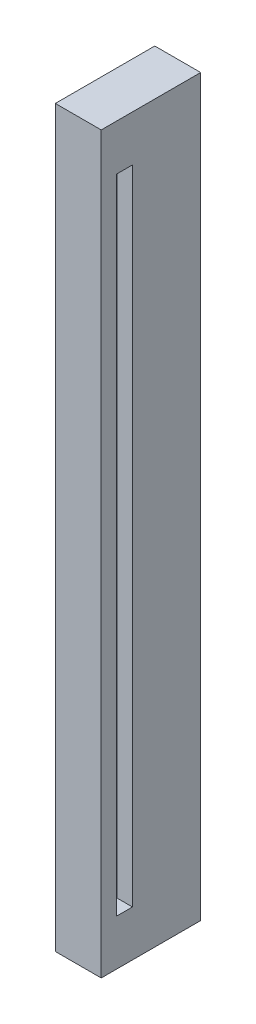
ISO-10303-21;
HEADER;
FILE_DESCRIPTION(('STEP AP214'),'2;1');
FILE_NAME('part.step','',(''),(''),'','','');
FILE_SCHEMA(('AUTOMOTIVE_DESIGN { 1 0 10303 214 1 1 1 1 }'));
ENDSEC;
DATA;
#1=APPLICATION_CONTEXT('core data for automotive mechanical design processes');
#2=APPLICATION_PROTOCOL_DEFINITION('international standard','automotive_design',2000,#1);
#3=PRODUCT_CONTEXT('',#1,'mechanical');
#4=PRODUCT('Part','Part','',(#3));
#5=PRODUCT_RELATED_PRODUCT_CATEGORY('part','',(#4));
#6=PRODUCT_DEFINITION_FORMATION('','',#4);
#7=PRODUCT_DEFINITION_CONTEXT('part definition',#1,'design');
#8=PRODUCT_DEFINITION('design','',#6,#7);
#9=PRODUCT_DEFINITION_SHAPE('','',#8);
#10=(LENGTH_UNIT() NAMED_UNIT(*) SI_UNIT(.MILLI.,.METRE.));
#11=(NAMED_UNIT(*) PLANE_ANGLE_UNIT() SI_UNIT($,.RADIAN.));
#12=(NAMED_UNIT(*) SI_UNIT($,.STERADIAN.) SOLID_ANGLE_UNIT());
#13=UNCERTAINTY_MEASURE_WITH_UNIT(LENGTH_MEASURE(1.E-05),#10,'distance_accuracy_value','');
#14=(GEOMETRIC_REPRESENTATION_CONTEXT(3) GLOBAL_UNCERTAINTY_ASSIGNED_CONTEXT((#13)) GLOBAL_UNIT_ASSIGNED_CONTEXT((#10,
#11,#12)) REPRESENTATION_CONTEXT('',''));
#15=CARTESIAN_POINT('',(0.,0.,0.));
#16=DIRECTION('',(0.,0.,1.));
#17=DIRECTION('',(1.,0.,0.));
#18=AXIS2_PLACEMENT_3D('',#15,#16,#17);
#19=CARTESIAN_POINT('',(9.525,-152.4,41.275));
#20=DIRECTION('',(-1.,0.,0.));
#21=DIRECTION('',(0.,0.,1.));
#22=AXIS2_PLACEMENT_3D('',#19,#20,#21);
#23=PLANE('',#22);
#24=DIRECTION('',(0.,0.,-1.));
#25=VECTOR('',#24,1.);
#26=CARTESIAN_POINT('',(9.525,-133.35,34.925));
#27=LINE('',#26,#25);
#28=CARTESIAN_POINT('',(9.525,-133.35,34.925));
#29=VERTEX_POINT('',#28);
#30=CARTESIAN_POINT('',(9.525,-133.35,28.321));
#31=VERTEX_POINT('',#30);
#32=EDGE_CURVE('E135',#29,#31,#27,.T.);
#33=ORIENTED_EDGE('',*,*,#32,.F.);
#34=DIRECTION('',(0.,-1.,0.));
#35=VECTOR('',#34,1.);
#36=CARTESIAN_POINT('',(9.525,133.35,34.925));
#37=LINE('',#36,#35);
#38=CARTESIAN_POINT('',(9.525,133.35,34.925));
#39=VERTEX_POINT('',#38);
#40=EDGE_CURVE('E47',#39,#29,#37,.T.);
#41=ORIENTED_EDGE('',*,*,#40,.F.);
#42=DIRECTION('',(0.,0.,1.));
#43=VECTOR('',#42,1.);
#44=CARTESIAN_POINT('',(9.525,133.35,34.925));
#45=LINE('',#44,#43);
#46=CARTESIAN_POINT('',(9.525,133.35,28.321));
#47=VERTEX_POINT('',#46);
#48=EDGE_CURVE('E126',#47,#39,#45,.T.);
#49=ORIENTED_EDGE('',*,*,#48,.F.);
#50=DIRECTION('',(0.,1.,0.));
#51=VECTOR('',#50,1.);
#52=CARTESIAN_POINT('',(9.525,133.35,28.321));
#53=LINE('',#52,#51);
#54=EDGE_CURVE('E129',#31,#47,#53,.T.);
#55=ORIENTED_EDGE('',*,*,#54,.F.);
#56=EDGE_LOOP('',(#33,#41,#49,#55));
#57=FACE_BOUND('',#56,.T.);
#58=DIRECTION('',(0.,1.,0.));
#59=VECTOR('',#58,1.);
#60=CARTESIAN_POINT('',(9.525,-152.4,0.));
#61=LINE('',#60,#59);
#62=CARTESIAN_POINT('',(9.525,-152.4,0.));
#63=VERTEX_POINT('',#62);
#64=CARTESIAN_POINT('',(9.525,152.4,0.));
#65=VERTEX_POINT('',#64);
#66=EDGE_CURVE('E141',#63,#65,#61,.T.);
#67=ORIENTED_EDGE('',*,*,#66,.T.);
#68=DIRECTION('',(0.,0.,-1.));
#69=VECTOR('',#68,1.);
#70=CARTESIAN_POINT('',(9.525,152.4,41.275));
#71=LINE('',#70,#69);
#72=CARTESIAN_POINT('',(9.525,152.4,41.275));
#73=VERTEX_POINT('',#72);
#74=EDGE_CURVE('E11',#73,#65,#71,.T.);
#75=ORIENTED_EDGE('',*,*,#74,.F.);
#76=DIRECTION('',(0.,1.,0.));
#77=VECTOR('',#76,1.);
#78=CARTESIAN_POINT('',(9.525,-152.4,41.275));
#79=LINE('',#78,#77);
#80=CARTESIAN_POINT('',(9.525,-152.4,41.275));
#81=VERTEX_POINT('',#80);
#82=EDGE_CURVE('E145',#81,#73,#79,.T.);
#83=ORIENTED_EDGE('',*,*,#82,.F.);
#84=DIRECTION('',(0.,0.,-1.));
#85=VECTOR('',#84,1.);
#86=CARTESIAN_POINT('',(9.525,-152.4,41.275));
#87=LINE('',#86,#85);
#88=EDGE_CURVE('E151',#81,#63,#87,.T.);
#89=ORIENTED_EDGE('',*,*,#88,.T.);
#90=EDGE_LOOP('',(#67,#75,#83,#89));
#91=FACE_BOUND('',#90,.T.);
#92=ADVANCED_FACE('F33',(#57,#91),#23,.F.);
#93=CARTESIAN_POINT('',(-9.525,152.4,41.275));
#94=DIRECTION('',(0.,-1.,0.));
#95=DIRECTION('',(0.,0.,-1.));
#96=AXIS2_PLACEMENT_3D('',#93,#94,#95);
#97=PLANE('',#96);
#98=DIRECTION('',(-1.,0.,0.));
#99=VECTOR('',#98,1.);
#100=CARTESIAN_POINT('',(-9.525,152.4,0.));
#101=LINE('',#100,#99);
#102=CARTESIAN_POINT('',(-9.525,152.4,0.));
#103=VERTEX_POINT('',#102);
#104=EDGE_CURVE('E154',#65,#103,#101,.T.);
#105=ORIENTED_EDGE('',*,*,#104,.T.);
#106=DIRECTION('',(0.,0.,-1.));
#107=VECTOR('',#106,1.);
#108=CARTESIAN_POINT('',(-9.525,152.4,41.275));
#109=LINE('',#108,#107);
#110=CARTESIAN_POINT('',(-9.525,152.4,41.275));
#111=VERTEX_POINT('',#110);
#112=EDGE_CURVE('E40',#111,#103,#109,.T.);
#113=ORIENTED_EDGE('',*,*,#112,.F.);
#114=DIRECTION('',(-1.,0.,0.));
#115=VECTOR('',#114,1.);
#116=CARTESIAN_POINT('',(-9.525,152.4,41.275));
#117=LINE('',#116,#115);
#118=EDGE_CURVE('E84',#73,#111,#117,.T.);
#119=ORIENTED_EDGE('',*,*,#118,.F.);
#120=ORIENTED_EDGE('',*,*,#74,.T.);
#121=EDGE_LOOP('',(#105,#113,#119,#120));
#122=FACE_BOUND('',#121,.T.);
#123=ADVANCED_FACE('F182',(#122),#97,.F.);
#124=CARTESIAN_POINT('',(-9.525,-152.4,41.275));
#125=DIRECTION('',(1.,0.,0.));
#126=DIRECTION('',(0.,0.,-1.));
#127=AXIS2_PLACEMENT_3D('',#124,#125,#126);
#128=PLANE('',#127);
#129=DIRECTION('',(0.,-1.,0.));
#130=VECTOR('',#129,1.);
#131=CARTESIAN_POINT('',(-9.525,-152.4,0.));
#132=LINE('',#131,#130);
#133=CARTESIAN_POINT('',(-9.525,-152.4,0.));
#134=VERTEX_POINT('',#133);
#135=EDGE_CURVE('E156',#103,#134,#132,.T.);
#136=ORIENTED_EDGE('',*,*,#135,.T.);
#137=DIRECTION('',(0.,0.,-1.));
#138=VECTOR('',#137,1.);
#139=CARTESIAN_POINT('',(-9.525,-152.4,41.275));
#140=LINE('',#139,#138);
#141=CARTESIAN_POINT('',(-9.525,-152.4,41.275));
#142=VERTEX_POINT('',#141);
#143=EDGE_CURVE('E160',#142,#134,#140,.T.);
#144=ORIENTED_EDGE('',*,*,#143,.F.);
#145=DIRECTION('',(0.,-1.,0.));
#146=VECTOR('',#145,1.);
#147=CARTESIAN_POINT('',(-9.525,-152.4,41.275));
#148=LINE('',#147,#146);
#149=EDGE_CURVE('E148',#111,#142,#148,.T.);
#150=ORIENTED_EDGE('',*,*,#149,.F.);
#151=ORIENTED_EDGE('',*,*,#112,.T.);
#152=EDGE_LOOP('',(#136,#144,#150,#151));
#153=FACE_BOUND('',#152,.T.);
#154=ADVANCED_FACE('F165',(#153),#128,.F.);
#155=CARTESIAN_POINT('',(-9.525,-152.4,41.275));
#156=DIRECTION('',(0.,1.,0.));
#157=DIRECTION('',(0.,0.,1.));
#158=AXIS2_PLACEMENT_3D('',#155,#156,#157);
#159=PLANE('',#158);
#160=DIRECTION('',(1.,0.,0.));
#161=VECTOR('',#160,1.);
#162=CARTESIAN_POINT('',(-9.525,-152.4,0.));
#163=LINE('',#162,#161);
#164=EDGE_CURVE('E77',#134,#63,#163,.T.);
#165=ORIENTED_EDGE('',*,*,#164,.T.);
#166=ORIENTED_EDGE('',*,*,#88,.F.);
#167=DIRECTION('',(1.,0.,0.));
#168=VECTOR('',#167,1.);
#169=CARTESIAN_POINT('',(-9.525,-152.4,41.275));
#170=LINE('',#169,#168);
#171=EDGE_CURVE('E56',#142,#81,#170,.T.);
#172=ORIENTED_EDGE('',*,*,#171,.F.);
#173=ORIENTED_EDGE('',*,*,#143,.T.);
#174=EDGE_LOOP('',(#165,#166,#172,#173));
#175=FACE_BOUND('',#174,.T.);
#176=ADVANCED_FACE('F173',(#175),#159,.F.);
#177=CARTESIAN_POINT('',(0.,0.,41.275));
#178=DIRECTION('',(0.,0.,-1.));
#179=DIRECTION('',(-1.,0.,0.));
#180=AXIS2_PLACEMENT_3D('',#177,#178,#179);
#181=PLANE('',#180);
#182=ORIENTED_EDGE('',*,*,#82,.T.);
#183=ORIENTED_EDGE('',*,*,#118,.T.);
#184=ORIENTED_EDGE('',*,*,#149,.T.);
#185=ORIENTED_EDGE('',*,*,#171,.T.);
#186=EDGE_LOOP('',(#182,#183,#184,#185));
#187=FACE_BOUND('',#186,.T.);
#188=ADVANCED_FACE('F175',(#187),#181,.F.);
#189=CARTESIAN_POINT('',(0.,0.,0.));
#190=DIRECTION('',(0.,0.,-1.));
#191=DIRECTION('',(-1.,0.,0.));
#192=AXIS2_PLACEMENT_3D('',#189,#190,#191);
#193=PLANE('',#192);
#194=ORIENTED_EDGE('',*,*,#66,.F.);
#195=ORIENTED_EDGE('',*,*,#164,.F.);
#196=ORIENTED_EDGE('',*,*,#135,.F.);
#197=ORIENTED_EDGE('',*,*,#104,.F.);
#198=EDGE_LOOP('',(#194,#195,#196,#197));
#199=FACE_BOUND('',#198,.T.);
#200=ADVANCED_FACE('F169',(#199),#193,.T.);
#201=CARTESIAN_POINT('',(3.175,133.35,34.925));
#202=DIRECTION('',(0.,0.,1.));
#203=DIRECTION('',(1.,0.,0.));
#204=AXIS2_PLACEMENT_3D('',#201,#202,#203);
#205=PLANE('',#204);
#206=ORIENTED_EDGE('',*,*,#40,.T.);
#207=DIRECTION('',(1.,0.,0.));
#208=VECTOR('',#207,1.);
#209=CARTESIAN_POINT('',(3.175,-133.35,34.925));
#210=LINE('',#209,#208);
#211=CARTESIAN_POINT('',(3.175,-133.35,34.925));
#212=VERTEX_POINT('',#211);
#213=EDGE_CURVE('E104',#212,#29,#210,.T.);
#214=ORIENTED_EDGE('',*,*,#213,.F.);
#215=DIRECTION('',(0.,-1.,0.));
#216=VECTOR('',#215,1.);
#217=CARTESIAN_POINT('',(3.175,133.35,34.925));
#218=LINE('',#217,#216);
#219=CARTESIAN_POINT('',(3.175,133.35,34.925));
#220=VERTEX_POINT('',#219);
#221=EDGE_CURVE('E108',#220,#212,#218,.T.);
#222=ORIENTED_EDGE('',*,*,#221,.F.);
#223=DIRECTION('',(1.,0.,0.));
#224=VECTOR('',#223,1.);
#225=CARTESIAN_POINT('',(3.175,133.35,34.925));
#226=LINE('',#225,#224);
#227=EDGE_CURVE('E139',#220,#39,#226,.T.);
#228=ORIENTED_EDGE('',*,*,#227,.T.);
#229=EDGE_LOOP('',(#206,#214,#222,#228));
#230=FACE_BOUND('',#229,.T.);
#231=ADVANCED_FACE('F106',(#230),#205,.F.);
#232=CARTESIAN_POINT('',(3.175,133.35,34.925));
#233=DIRECTION('',(0.,1.,0.));
#234=DIRECTION('',(0.,0.,1.));
#235=AXIS2_PLACEMENT_3D('',#232,#233,#234);
#236=PLANE('',#235);
#237=ORIENTED_EDGE('',*,*,#48,.T.);
#238=ORIENTED_EDGE('',*,*,#227,.F.);
#239=DIRECTION('',(0.,0.,1.));
#240=VECTOR('',#239,1.);
#241=CARTESIAN_POINT('',(3.175,133.35,34.925));
#242=LINE('',#241,#240);
#243=CARTESIAN_POINT('',(3.175,133.35,28.321));
#244=VERTEX_POINT('',#243);
#245=EDGE_CURVE('E114',#244,#220,#242,.T.);
#246=ORIENTED_EDGE('',*,*,#245,.F.);
#247=DIRECTION('',(1.,0.,0.));
#248=VECTOR('',#247,1.);
#249=CARTESIAN_POINT('',(3.175,133.35,28.321));
#250=LINE('',#249,#248);
#251=EDGE_CURVE('E142',#244,#47,#250,.T.);
#252=ORIENTED_EDGE('',*,*,#251,.T.);
#253=EDGE_LOOP('',(#237,#238,#246,#252));
#254=FACE_BOUND('',#253,.T.);
#255=ADVANCED_FACE('F195',(#254),#236,.F.);
#256=CARTESIAN_POINT('',(3.175,133.35,28.321));
#257=DIRECTION('',(0.,0.,-1.));
#258=DIRECTION('',(-1.,0.,0.));
#259=AXIS2_PLACEMENT_3D('',#256,#257,#258);
#260=PLANE('',#259);
#261=ORIENTED_EDGE('',*,*,#54,.T.);
#262=ORIENTED_EDGE('',*,*,#251,.F.);
#263=DIRECTION('',(0.,1.,0.));
#264=VECTOR('',#263,1.);
#265=CARTESIAN_POINT('',(3.175,133.35,28.321));
#266=LINE('',#265,#264);
#267=CARTESIAN_POINT('',(3.175,-133.35,28.321));
#268=VERTEX_POINT('',#267);
#269=EDGE_CURVE('E122',#268,#244,#266,.T.);
#270=ORIENTED_EDGE('',*,*,#269,.F.);
#271=DIRECTION('',(1.,0.,0.));
#272=VECTOR('',#271,1.);
#273=CARTESIAN_POINT('',(3.175,-133.35,28.321));
#274=LINE('',#273,#272);
#275=EDGE_CURVE('E113',#268,#31,#274,.T.);
#276=ORIENTED_EDGE('',*,*,#275,.T.);
#277=EDGE_LOOP('',(#261,#262,#270,#276));
#278=FACE_BOUND('',#277,.T.);
#279=ADVANCED_FACE('F193',(#278),#260,.F.);
#280=CARTESIAN_POINT('',(3.175,-133.35,34.925));
#281=DIRECTION('',(0.,-1.,0.));
#282=DIRECTION('',(0.,0.,-1.));
#283=AXIS2_PLACEMENT_3D('',#280,#281,#282);
#284=PLANE('',#283);
#285=ORIENTED_EDGE('',*,*,#32,.T.);
#286=ORIENTED_EDGE('',*,*,#275,.F.);
#287=DIRECTION('',(0.,0.,-1.));
#288=VECTOR('',#287,1.);
#289=CARTESIAN_POINT('',(3.175,-133.35,34.925));
#290=LINE('',#289,#288);
#291=EDGE_CURVE('E117',#212,#268,#290,.T.);
#292=ORIENTED_EDGE('',*,*,#291,.F.);
#293=ORIENTED_EDGE('',*,*,#213,.T.);
#294=EDGE_LOOP('',(#285,#286,#292,#293));
#295=FACE_BOUND('',#294,.T.);
#296=ADVANCED_FACE('F118',(#295),#284,.F.);
#297=CARTESIAN_POINT('',(3.175,0.,0.));
#298=DIRECTION('',(1.,0.,0.));
#299=DIRECTION('',(0.,0.,-1.));
#300=AXIS2_PLACEMENT_3D('',#297,#298,#299);
#301=PLANE('',#300);
#302=ORIENTED_EDGE('',*,*,#221,.T.);
#303=ORIENTED_EDGE('',*,*,#291,.T.);
#304=ORIENTED_EDGE('',*,*,#269,.T.);
#305=ORIENTED_EDGE('',*,*,#245,.T.);
#306=EDGE_LOOP('',(#302,#303,#304,#305));
#307=FACE_BOUND('',#306,.T.);
#308=ADVANCED_FACE('F124',(#307),#301,.T.);
#309=CLOSED_SHELL('',(#92,#123,#154,#176,#188,#200,#231,#255,#279,#296,#308));
#310=MANIFOLD_SOLID_BREP('B2',#309);
#311=ADVANCED_BREP_SHAPE_REPRESENTATION('',(#18,#310),#14);
#312=SHAPE_DEFINITION_REPRESENTATION(#9,#311);
ENDSEC;
END-ISO-10303-21;
